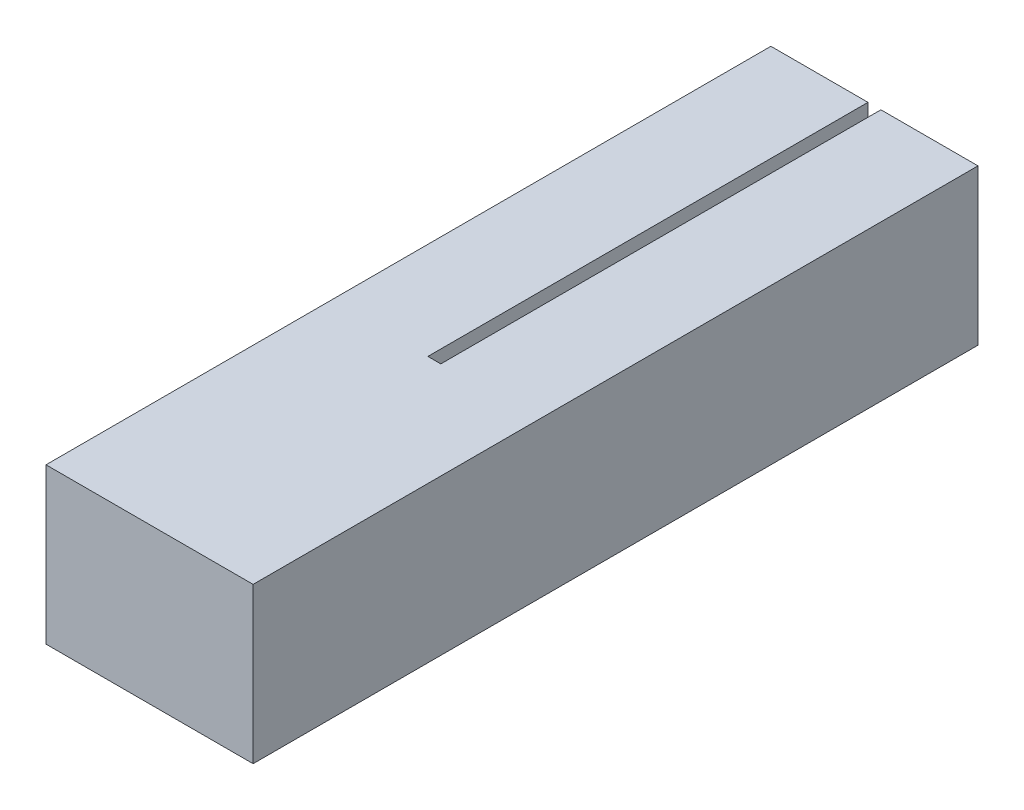
ISO-10303-21;
HEADER;
FILE_DESCRIPTION(('STEP AP214'),'2;1');
FILE_NAME('part.step','',(''),(''),'','','');
FILE_SCHEMA(('AUTOMOTIVE_DESIGN { 1 0 10303 214 1 1 1 1 }'));
ENDSEC;
DATA;
#1=APPLICATION_CONTEXT('core data for automotive mechanical design processes');
#2=APPLICATION_PROTOCOL_DEFINITION('international standard','automotive_design',2000,#1);
#3=PRODUCT_CONTEXT('',#1,'mechanical');
#4=PRODUCT('Part','Part','',(#3));
#5=PRODUCT_RELATED_PRODUCT_CATEGORY('part','',(#4));
#6=PRODUCT_DEFINITION_FORMATION('','',#4);
#7=PRODUCT_DEFINITION_CONTEXT('part definition',#1,'design');
#8=PRODUCT_DEFINITION('design','',#6,#7);
#9=PRODUCT_DEFINITION_SHAPE('','',#8);
#10=(LENGTH_UNIT() NAMED_UNIT(*) SI_UNIT(.MILLI.,.METRE.));
#11=(NAMED_UNIT(*) PLANE_ANGLE_UNIT() SI_UNIT($,.RADIAN.));
#12=(NAMED_UNIT(*) SI_UNIT($,.STERADIAN.) SOLID_ANGLE_UNIT());
#13=UNCERTAINTY_MEASURE_WITH_UNIT(LENGTH_MEASURE(1.E-05),#10,'distance_accuracy_value','');
#14=(GEOMETRIC_REPRESENTATION_CONTEXT(3) GLOBAL_UNCERTAINTY_ASSIGNED_CONTEXT((#13)) GLOBAL_UNIT_ASSIGNED_CONTEXT((#10,
#11,#12)) REPRESENTATION_CONTEXT('',''));
#15=CARTESIAN_POINT('',(0.,0.,0.));
#16=DIRECTION('',(0.,0.,1.));
#17=DIRECTION('',(1.,0.,0.));
#18=AXIS2_PLACEMENT_3D('',#15,#16,#17);
#19=CARTESIAN_POINT('',(0.,19.05,-88.9));
#20=DIRECTION('',(0.,0.,1.));
#21=DIRECTION('',(1.,0.,0.));
#22=AXIS2_PLACEMENT_3D('',#19,#20,#21);
#23=PLANE('',#22);
#24=DIRECTION('',(-1.,0.,0.));
#25=VECTOR('',#24,1.);
#26=CARTESIAN_POINT('',(0.,19.05,-88.9));
#27=LINE('',#26,#25);
#28=CARTESIAN_POINT('',(11.90625,19.05,-88.9));
#29=VERTEX_POINT('',#28);
#30=CARTESIAN_POINT('',(0.,19.05,-88.9));
#31=VERTEX_POINT('',#30);
#32=EDGE_CURVE('E57',#29,#31,#27,.T.);
#33=ORIENTED_EDGE('',*,*,#32,.F.);
#34=DIRECTION('',(0.,1.,0.));
#35=VECTOR('',#34,1.);
#36=CARTESIAN_POINT('',(11.90625,0.,-88.9));
#37=LINE('',#36,#35);
#38=CARTESIAN_POINT('',(11.90625,0.,-88.9));
#39=VERTEX_POINT('',#38);
#40=EDGE_CURVE('E133',#39,#29,#37,.T.);
#41=ORIENTED_EDGE('',*,*,#40,.F.);
#42=DIRECTION('',(-1.,0.,0.));
#43=VECTOR('',#42,1.);
#44=CARTESIAN_POINT('',(0.,0.,-88.9));
#45=LINE('',#44,#43);
#46=CARTESIAN_POINT('',(0.,0.,-88.9));
#47=VERTEX_POINT('',#46);
#48=EDGE_CURVE('E79',#39,#47,#45,.T.);
#49=ORIENTED_EDGE('',*,*,#48,.T.);
#50=DIRECTION('',(0.,-1.,0.));
#51=VECTOR('',#50,1.);
#52=CARTESIAN_POINT('',(0.,19.05,-88.9));
#53=LINE('',#52,#51);
#54=EDGE_CURVE('E149',#31,#47,#53,.T.);
#55=ORIENTED_EDGE('',*,*,#54,.F.);
#56=EDGE_LOOP('',(#33,#41,#49,#55));
#57=FACE_BOUND('',#56,.T.);
#58=ADVANCED_FACE('F33',(#57),#23,.F.);
#59=CARTESIAN_POINT('',(0.,19.05,0.));
#60=DIRECTION('',(1.,0.,0.));
#61=DIRECTION('',(0.,0.,-1.));
#62=AXIS2_PLACEMENT_3D('',#59,#60,#61);
#63=PLANE('',#62);
#64=DIRECTION('',(0.,0.,1.));
#65=VECTOR('',#64,1.);
#66=CARTESIAN_POINT('',(0.,0.,0.));
#67=LINE('',#66,#65);
#68=CARTESIAN_POINT('',(0.,0.,0.));
#69=VERTEX_POINT('',#68);
#70=EDGE_CURVE('E135',#47,#69,#67,.T.);
#71=ORIENTED_EDGE('',*,*,#70,.T.);
#72=DIRECTION('',(0.,-1.,0.));
#73=VECTOR('',#72,1.);
#74=CARTESIAN_POINT('',(0.,19.05,0.));
#75=LINE('',#74,#73);
#76=CARTESIAN_POINT('',(0.,19.05,0.));
#77=VERTEX_POINT('',#76);
#78=EDGE_CURVE('E11',#77,#69,#75,.T.);
#79=ORIENTED_EDGE('',*,*,#78,.F.);
#80=DIRECTION('',(0.,0.,1.));
#81=VECTOR('',#80,1.);
#82=CARTESIAN_POINT('',(0.,19.05,0.));
#83=LINE('',#82,#81);
#84=EDGE_CURVE('E140',#31,#77,#83,.T.);
#85=ORIENTED_EDGE('',*,*,#84,.F.);
#86=ORIENTED_EDGE('',*,*,#54,.T.);
#87=EDGE_LOOP('',(#71,#79,#85,#86));
#88=FACE_BOUND('',#87,.T.);
#89=ADVANCED_FACE('F35',(#88),#63,.F.);
#90=CARTESIAN_POINT('',(0.,19.05,0.));
#91=DIRECTION('',(0.,0.,-1.));
#92=DIRECTION('',(-1.,0.,0.));
#93=AXIS2_PLACEMENT_3D('',#90,#91,#92);
#94=PLANE('',#93);
#95=DIRECTION('',(1.,0.,0.));
#96=VECTOR('',#95,1.);
#97=CARTESIAN_POINT('',(0.,0.,0.));
#98=LINE('',#97,#96);
#99=CARTESIAN_POINT('',(25.4,0.,0.));
#100=VERTEX_POINT('',#99);
#101=EDGE_CURVE('E152',#69,#100,#98,.T.);
#102=ORIENTED_EDGE('',*,*,#101,.T.);
#103=DIRECTION('',(0.,-1.,0.));
#104=VECTOR('',#103,1.);
#105=CARTESIAN_POINT('',(25.4,19.05,0.));
#106=LINE('',#105,#104);
#107=CARTESIAN_POINT('',(25.4,19.05,0.));
#108=VERTEX_POINT('',#107);
#109=EDGE_CURVE('E41',#108,#100,#106,.T.);
#110=ORIENTED_EDGE('',*,*,#109,.F.);
#111=DIRECTION('',(1.,0.,0.));
#112=VECTOR('',#111,1.);
#113=CARTESIAN_POINT('',(0.,19.05,0.));
#114=LINE('',#113,#112);
#115=EDGE_CURVE('E86',#77,#108,#114,.T.);
#116=ORIENTED_EDGE('',*,*,#115,.F.);
#117=ORIENTED_EDGE('',*,*,#78,.T.);
#118=EDGE_LOOP('',(#102,#110,#116,#117));
#119=FACE_BOUND('',#118,.T.);
#120=ADVANCED_FACE('F176',(#119),#94,.F.);
#121=CARTESIAN_POINT('',(25.4,19.05,0.));
#122=DIRECTION('',(-1.,0.,0.));
#123=DIRECTION('',(0.,0.,1.));
#124=AXIS2_PLACEMENT_3D('',#121,#122,#123);
#125=PLANE('',#124);
#126=DIRECTION('',(0.,0.,-1.));
#127=VECTOR('',#126,1.);
#128=CARTESIAN_POINT('',(25.4,0.,0.));
#129=LINE('',#128,#127);
#130=CARTESIAN_POINT('',(25.4,0.,-88.9));
#131=VERTEX_POINT('',#130);
#132=EDGE_CURVE('E154',#100,#131,#129,.T.);
#133=ORIENTED_EDGE('',*,*,#132,.T.);
#134=DIRECTION('',(0.,-1.,0.));
#135=VECTOR('',#134,1.);
#136=CARTESIAN_POINT('',(25.4,19.05,-88.9));
#137=LINE('',#136,#135);
#138=CARTESIAN_POINT('',(25.4,19.05,-88.9));
#139=VERTEX_POINT('',#138);
#140=EDGE_CURVE('E159',#139,#131,#137,.T.);
#141=ORIENTED_EDGE('',*,*,#140,.F.);
#142=DIRECTION('',(0.,0.,-1.));
#143=VECTOR('',#142,1.);
#144=CARTESIAN_POINT('',(25.4,19.05,0.));
#145=LINE('',#144,#143);
#146=EDGE_CURVE('E144',#108,#139,#145,.T.);
#147=ORIENTED_EDGE('',*,*,#146,.F.);
#148=ORIENTED_EDGE('',*,*,#109,.T.);
#149=EDGE_LOOP('',(#133,#141,#147,#148));
#150=FACE_BOUND('',#149,.T.);
#151=ADVANCED_FACE('F165',(#150),#125,.F.);
#152=CARTESIAN_POINT('',(13.49375,0.,-88.9));
#153=VERTEX_POINT('',#152);
#154=EDGE_CURVE('E142',#131,#153,#45,.T.);
#155=ORIENTED_EDGE('',*,*,#154,.T.);
#156=DIRECTION('',(0.,1.,0.));
#157=VECTOR('',#156,1.);
#158=CARTESIAN_POINT('',(13.49375,0.,-88.9));
#159=LINE('',#158,#157);
#160=CARTESIAN_POINT('',(13.49375,19.05,-88.9));
#161=VERTEX_POINT('',#160);
#162=EDGE_CURVE('E136',#153,#161,#159,.T.);
#163=ORIENTED_EDGE('',*,*,#162,.T.);
#164=EDGE_CURVE('E146',#139,#161,#27,.T.);
#165=ORIENTED_EDGE('',*,*,#164,.F.);
#166=ORIENTED_EDGE('',*,*,#140,.T.);
#167=EDGE_LOOP('',(#155,#163,#165,#166));
#168=FACE_BOUND('',#167,.T.);
#169=ADVANCED_FACE('F169',(#168),#23,.F.);
#170=CARTESIAN_POINT('',(0.,19.05,0.));
#171=DIRECTION('',(0.,-1.,0.));
#172=DIRECTION('',(0.,0.,-1.));
#173=AXIS2_PLACEMENT_3D('',#170,#171,#172);
#174=PLANE('',#173);
#175=DIRECTION('',(1.,0.,0.));
#176=VECTOR('',#175,1.);
#177=CARTESIAN_POINT('',(11.90625,19.05,-34.925));
#178=LINE('',#177,#176);
#179=CARTESIAN_POINT('',(11.90625,19.05,-34.925));
#180=VERTEX_POINT('',#179);
#181=CARTESIAN_POINT('',(13.49375,19.05,-34.925));
#182=VERTEX_POINT('',#181);
#183=EDGE_CURVE('E127',#180,#182,#178,.T.);
#184=ORIENTED_EDGE('',*,*,#183,.F.);
#185=DIRECTION('',(0.,0.,1.));
#186=VECTOR('',#185,1.);
#187=CARTESIAN_POINT('',(11.90625,19.05,-88.9));
#188=LINE('',#187,#186);
#189=EDGE_CURVE('E112',#29,#180,#188,.T.);
#190=ORIENTED_EDGE('',*,*,#189,.F.);
#191=ORIENTED_EDGE('',*,*,#32,.T.);
#192=ORIENTED_EDGE('',*,*,#84,.T.);
#193=ORIENTED_EDGE('',*,*,#115,.T.);
#194=ORIENTED_EDGE('',*,*,#146,.T.);
#195=ORIENTED_EDGE('',*,*,#164,.T.);
#196=DIRECTION('',(0.,0.,-1.));
#197=VECTOR('',#196,1.);
#198=CARTESIAN_POINT('',(13.49375,19.05,-88.9));
#199=LINE('',#198,#197);
#200=EDGE_CURVE('E125',#182,#161,#199,.T.);
#201=ORIENTED_EDGE('',*,*,#200,.F.);
#202=EDGE_LOOP('',(#184,#190,#191,#192,#193,#194,#195,#201));
#203=FACE_BOUND('',#202,.T.);
#204=ADVANCED_FACE('F172',(#203),#174,.F.);
#205=CARTESIAN_POINT('',(0.,0.,0.));
#206=DIRECTION('',(0.,-1.,0.));
#207=DIRECTION('',(0.,0.,-1.));
#208=AXIS2_PLACEMENT_3D('',#205,#206,#207);
#209=PLANE('',#208);
#210=DIRECTION('',(0.,0.,1.));
#211=VECTOR('',#210,1.);
#212=CARTESIAN_POINT('',(11.90625,0.,-88.9));
#213=LINE('',#212,#211);
#214=CARTESIAN_POINT('',(11.90625,0.,-34.925));
#215=VERTEX_POINT('',#214);
#216=EDGE_CURVE('E111',#39,#215,#213,.T.);
#217=ORIENTED_EDGE('',*,*,#216,.T.);
#218=DIRECTION('',(1.,0.,0.));
#219=VECTOR('',#218,1.);
#220=CARTESIAN_POINT('',(11.90625,0.,-34.925));
#221=LINE('',#220,#219);
#222=CARTESIAN_POINT('',(13.49375,0.,-34.925));
#223=VERTEX_POINT('',#222);
#224=EDGE_CURVE('E119',#215,#223,#221,.T.);
#225=ORIENTED_EDGE('',*,*,#224,.T.);
#226=DIRECTION('',(0.,0.,-1.));
#227=VECTOR('',#226,1.);
#228=CARTESIAN_POINT('',(13.49375,0.,-88.9));
#229=LINE('',#228,#227);
#230=EDGE_CURVE('E48',#223,#153,#229,.T.);
#231=ORIENTED_EDGE('',*,*,#230,.T.);
#232=ORIENTED_EDGE('',*,*,#154,.F.);
#233=ORIENTED_EDGE('',*,*,#132,.F.);
#234=ORIENTED_EDGE('',*,*,#101,.F.);
#235=ORIENTED_EDGE('',*,*,#70,.F.);
#236=ORIENTED_EDGE('',*,*,#48,.F.);
#237=EDGE_LOOP('',(#217,#225,#231,#232,#233,#234,#235,#236));
#238=FACE_BOUND('',#237,.T.);
#239=ADVANCED_FACE('F123',(#238),#209,.T.);
#240=CARTESIAN_POINT('',(11.90625,0.,-88.9));
#241=DIRECTION('',(-1.,0.,0.));
#242=DIRECTION('',(0.,0.,1.));
#243=AXIS2_PLACEMENT_3D('',#240,#241,#242);
#244=PLANE('',#243);
#245=ORIENTED_EDGE('',*,*,#189,.T.);
#246=DIRECTION('',(0.,1.,0.));
#247=VECTOR('',#246,1.);
#248=CARTESIAN_POINT('',(11.90625,0.,-34.925));
#249=LINE('',#248,#247);
#250=EDGE_CURVE('E107',#215,#180,#249,.T.);
#251=ORIENTED_EDGE('',*,*,#250,.F.);
#252=ORIENTED_EDGE('',*,*,#216,.F.);
#253=ORIENTED_EDGE('',*,*,#40,.T.);
#254=EDGE_LOOP('',(#245,#251,#252,#253));
#255=FACE_BOUND('',#254,.T.);
#256=ADVANCED_FACE('F109',(#255),#244,.F.);
#257=CARTESIAN_POINT('',(13.49375,0.,-88.9));
#258=DIRECTION('',(1.,0.,0.));
#259=DIRECTION('',(0.,0.,-1.));
#260=AXIS2_PLACEMENT_3D('',#257,#258,#259);
#261=PLANE('',#260);
#262=ORIENTED_EDGE('',*,*,#200,.T.);
#263=ORIENTED_EDGE('',*,*,#162,.F.);
#264=ORIENTED_EDGE('',*,*,#230,.F.);
#265=DIRECTION('',(0.,1.,0.));
#266=VECTOR('',#265,1.);
#267=CARTESIAN_POINT('',(13.49375,0.,-34.925));
#268=LINE('',#267,#266);
#269=EDGE_CURVE('E116',#223,#182,#268,.T.);
#270=ORIENTED_EDGE('',*,*,#269,.T.);
#271=EDGE_LOOP('',(#262,#263,#264,#270));
#272=FACE_BOUND('',#271,.T.);
#273=ADVANCED_FACE('F199',(#272),#261,.F.);
#274=CARTESIAN_POINT('',(11.90625,0.,-34.925));
#275=DIRECTION('',(0.,0.,1.));
#276=DIRECTION('',(1.,0.,0.));
#277=AXIS2_PLACEMENT_3D('',#274,#275,#276);
#278=PLANE('',#277);
#279=ORIENTED_EDGE('',*,*,#183,.T.);
#280=ORIENTED_EDGE('',*,*,#269,.F.);
#281=ORIENTED_EDGE('',*,*,#224,.F.);
#282=ORIENTED_EDGE('',*,*,#250,.T.);
#283=EDGE_LOOP('',(#279,#280,#281,#282));
#284=FACE_BOUND('',#283,.T.);
#285=ADVANCED_FACE('F120',(#284),#278,.F.);
#286=CLOSED_SHELL('',(#58,#89,#120,#151,#169,#204,#239,#256,#273,#285));
#287=MANIFOLD_SOLID_BREP('B2',#286);
#288=ADVANCED_BREP_SHAPE_REPRESENTATION('',(#18,#287),#14);
#289=SHAPE_DEFINITION_REPRESENTATION(#9,#288);
ENDSEC;
END-ISO-10303-21;
